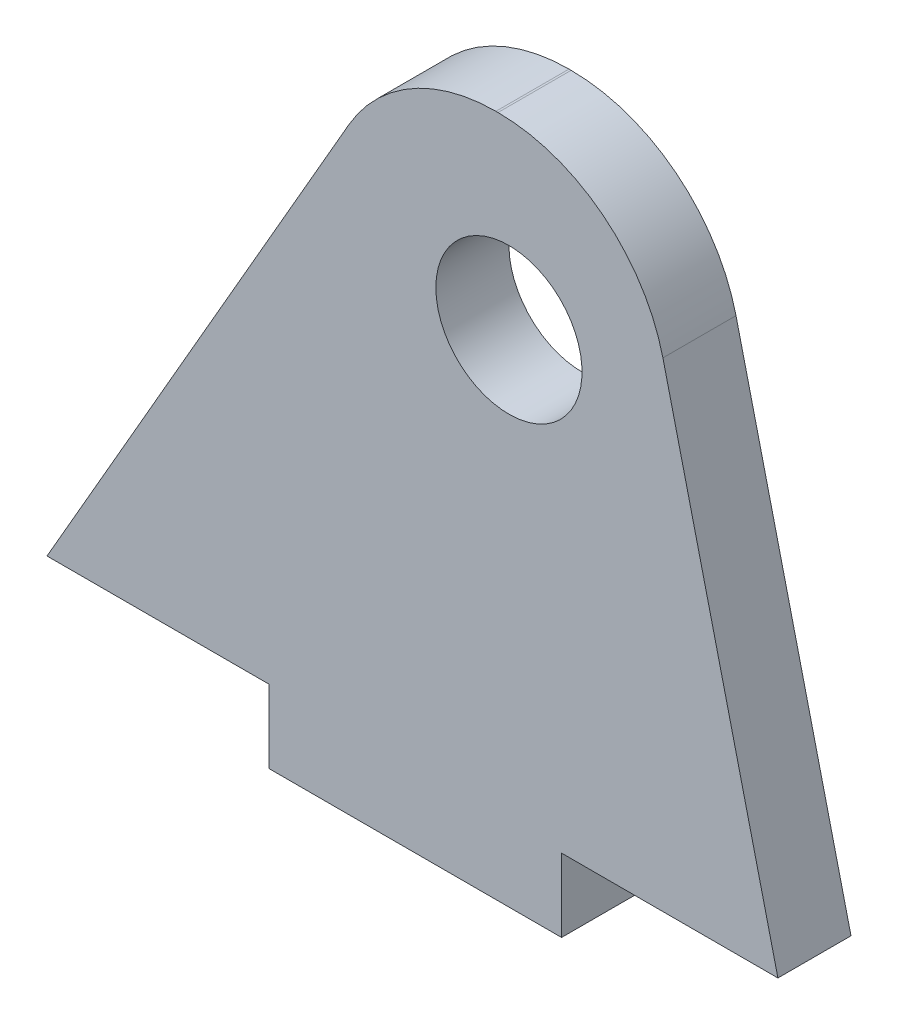
ISO-10303-21;
HEADER;
FILE_DESCRIPTION(('STEP AP214'),'2;1');
FILE_NAME('part.step','',(''),(''),'','','');
FILE_SCHEMA(('AUTOMOTIVE_DESIGN { 1 0 10303 214 1 1 1 1 }'));
ENDSEC;
DATA;
#1=APPLICATION_CONTEXT('core data for automotive mechanical design processes');
#2=APPLICATION_PROTOCOL_DEFINITION('international standard','automotive_design',2000,#1);
#3=PRODUCT_CONTEXT('',#1,'mechanical');
#4=PRODUCT('Part','Part','',(#3));
#5=PRODUCT_RELATED_PRODUCT_CATEGORY('part','',(#4));
#6=PRODUCT_DEFINITION_FORMATION('','',#4);
#7=PRODUCT_DEFINITION_CONTEXT('part definition',#1,'design');
#8=PRODUCT_DEFINITION('design','',#6,#7);
#9=PRODUCT_DEFINITION_SHAPE('','',#8);
#10=(LENGTH_UNIT() NAMED_UNIT(*) SI_UNIT(.MILLI.,.METRE.));
#11=(NAMED_UNIT(*) PLANE_ANGLE_UNIT() SI_UNIT($,.RADIAN.));
#12=(NAMED_UNIT(*) SI_UNIT($,.STERADIAN.) SOLID_ANGLE_UNIT());
#13=UNCERTAINTY_MEASURE_WITH_UNIT(LENGTH_MEASURE(1.E-05),#10,'distance_accuracy_value','');
#14=(GEOMETRIC_REPRESENTATION_CONTEXT(3) GLOBAL_UNCERTAINTY_ASSIGNED_CONTEXT((#13)) GLOBAL_UNIT_ASSIGNED_CONTEXT((#10,
#11,#12)) REPRESENTATION_CONTEXT('',''));
#15=CARTESIAN_POINT('',(0.,0.,0.));
#16=DIRECTION('',(0.,0.,1.));
#17=DIRECTION('',(1.,0.,0.));
#18=AXIS2_PLACEMENT_3D('',#15,#16,#17);
#19=CARTESIAN_POINT('',(-62.178178995026,0.,3.175));
#20=DIRECTION('',(0.,1.,0.));
#21=DIRECTION('',(0.,0.,1.));
#22=AXIS2_PLACEMENT_3D('',#19,#20,#21);
#23=PLANE('',#22);
#24=DIRECTION('',(0.,0.,-1.));
#25=VECTOR('',#24,1.);
#26=CARTESIAN_POINT('',(-52.526178995026,0.,3.175));
#27=LINE('',#26,#25);
#28=CARTESIAN_POINT('',(-52.526178995026,0.,3.175));
#29=VERTEX_POINT('',#28);
#30=CARTESIAN_POINT('',(-52.526178995026,0.,0.));
#31=VERTEX_POINT('',#30);
#32=EDGE_CURVE('E213',#29,#31,#27,.T.);
#33=ORIENTED_EDGE('',*,*,#32,.F.);
#34=DIRECTION('',(1.,0.,0.));
#35=VECTOR('',#34,1.);
#36=CARTESIAN_POINT('',(-62.178178995026,0.,3.175));
#37=LINE('',#36,#35);
#38=CARTESIAN_POINT('',(-62.178178995026,0.,3.175));
#39=VERTEX_POINT('',#38);
#40=EDGE_CURVE('E142',#39,#29,#37,.T.);
#41=ORIENTED_EDGE('',*,*,#40,.F.);
#42=DIRECTION('',(0.,0.,-1.));
#43=VECTOR('',#42,1.);
#44=CARTESIAN_POINT('',(-62.178178995026,0.,3.175));
#45=LINE('',#44,#43);
#46=CARTESIAN_POINT('',(-62.178178995026,0.,0.));
#47=VERTEX_POINT('',#46);
#48=EDGE_CURVE('E148',#39,#47,#45,.T.);
#49=ORIENTED_EDGE('',*,*,#48,.T.);
#50=DIRECTION('',(1.,0.,0.));
#51=VECTOR('',#50,1.);
#52=CARTESIAN_POINT('',(-62.178178995026,0.,0.));
#53=LINE('',#52,#51);
#54=EDGE_CURVE('E143',#47,#31,#53,.T.);
#55=ORIENTED_EDGE('',*,*,#54,.T.);
#56=EDGE_LOOP('',(#33,#41,#49,#55));
#57=FACE_BOUND('',#56,.T.);
#58=ADVANCED_FACE('F39',(#57),#23,.F.);
#59=CARTESIAN_POINT('',(-39.826178995026,0.,3.175));
#60=VERTEX_POINT('',#59);
#61=CARTESIAN_POINT('',(-30.428178995026,0.,3.175));
#62=VERTEX_POINT('',#61);
#63=EDGE_CURVE('E130',#60,#62,#37,.T.);
#64=ORIENTED_EDGE('',*,*,#63,.F.);
#65=DIRECTION('',(0.,0.,-1.));
#66=VECTOR('',#65,1.);
#67=CARTESIAN_POINT('',(-39.826178995026,0.,3.175));
#68=LINE('',#67,#66);
#69=CARTESIAN_POINT('',(-39.826178995026,0.,0.));
#70=VERTEX_POINT('',#69);
#71=EDGE_CURVE('E115',#60,#70,#68,.T.);
#72=ORIENTED_EDGE('',*,*,#71,.T.);
#73=CARTESIAN_POINT('',(-30.428178995026,0.,0.));
#74=VERTEX_POINT('',#73);
#75=EDGE_CURVE('E150',#70,#74,#53,.T.);
#76=ORIENTED_EDGE('',*,*,#75,.T.);
#77=DIRECTION('',(0.,0.,-1.));
#78=VECTOR('',#77,1.);
#79=CARTESIAN_POINT('',(-30.428178995026,0.,3.175));
#80=LINE('',#79,#78);
#81=EDGE_CURVE('E140',#62,#74,#80,.T.);
#82=ORIENTED_EDGE('',*,*,#81,.F.);
#83=EDGE_LOOP('',(#64,#72,#76,#82));
#84=FACE_BOUND('',#83,.T.);
#85=ADVANCED_FACE('F138',(#84),#23,.F.);
#86=CARTESIAN_POINT('',(0.,0.,3.175));
#87=DIRECTION('',(0.,0.,1.));
#88=DIRECTION('',(1.,0.,0.));
#89=AXIS2_PLACEMENT_3D('',#86,#87,#88);
#90=PLANE('',#89);
#91=CARTESIAN_POINT('',(-42.1121789950262,18.542,3.175));
#92=DIRECTION('',(0.,0.,-1.));
#93=DIRECTION('',(-1.,0.,0.));
#94=AXIS2_PLACEMENT_3D('',#91,#92,#93);
#95=CIRCLE('',#94,3.175);
#96=CARTESIAN_POINT('',(-45.2871789950262,18.542,3.175));
#97=VERTEX_POINT('',#96);
#98=EDGE_CURVE('E153',#97,#97,#95,.T.);
#99=ORIENTED_EDGE('',*,*,#98,.T.);
#100=EDGE_LOOP('',(#99));
#101=FACE_BOUND('',#100,.T.);
#102=DIRECTION('',(1.,0.,0.));
#103=VECTOR('',#102,1.);
#104=CARTESIAN_POINT('',(0.,26.4795,3.175));
#105=LINE('',#104,#103);
#106=CARTESIAN_POINT('',(-42.6787402517282,26.4795,3.175));
#107=VERTEX_POINT('',#106);
#108=CARTESIAN_POINT('',(-42.586593378841,26.4795,3.175));
#109=VERTEX_POINT('',#108);
#110=EDGE_CURVE('E185',#107,#109,#105,.T.);
#111=ORIENTED_EDGE('',*,*,#110,.F.);
#112=CARTESIAN_POINT('',(-42.6787402517282,19.1135,3.175));
#113=DIRECTION('',(0.,0.,1.));
#114=DIRECTION('',(1.,0.,0.));
#115=AXIS2_PLACEMENT_3D('',#112,#113,#114);
#116=CIRCLE('',#115,7.366);
#117=CARTESIAN_POINT('',(-49.0628830128672,22.7878267690009,3.175));
#118=VERTEX_POINT('',#117);
#119=EDGE_CURVE('E48',#107,#118,#116,.T.);
#120=ORIENTED_EDGE('',*,*,#119,.T.);
#121=DIRECTION('',(0.498822531767699,0.866704148946377,0.));
#122=VECTOR('',#121,1.);
#123=CARTESIAN_POINT('',(-46.7067608709964,26.8815889905015,3.175));
#124=LINE('',#123,#122);
#125=EDGE_CURVE('E182',#39,#118,#124,.T.);
#126=ORIENTED_EDGE('',*,*,#125,.F.);
#127=ORIENTED_EDGE('',*,*,#40,.T.);
#128=DIRECTION('',(0.,1.,0.));
#129=VECTOR('',#128,1.);
#130=CARTESIAN_POINT('',(-52.526178995026,-3.175,3.175));
#131=LINE('',#130,#129);
#132=CARTESIAN_POINT('',(-52.526178995026,-3.175,3.175));
#133=VERTEX_POINT('',#132);
#134=EDGE_CURVE('E124',#133,#29,#131,.T.);
#135=ORIENTED_EDGE('',*,*,#134,.F.);
#136=DIRECTION('',(-1.,0.,0.));
#137=VECTOR('',#136,1.);
#138=CARTESIAN_POINT('',(-39.826178995026,-3.175,3.175));
#139=LINE('',#138,#137);
#140=CARTESIAN_POINT('',(-39.826178995026,-3.175,3.175));
#141=VERTEX_POINT('',#140);
#142=EDGE_CURVE('E133',#141,#133,#139,.T.);
#143=ORIENTED_EDGE('',*,*,#142,.F.);
#144=DIRECTION('',(0.,-1.,0.));
#145=VECTOR('',#144,1.);
#146=CARTESIAN_POINT('',(-39.826178995026,0.,3.175));
#147=LINE('',#146,#145);
#148=EDGE_CURVE('E118',#60,#141,#147,.T.);
#149=ORIENTED_EDGE('',*,*,#148,.F.);
#150=ORIENTED_EDGE('',*,*,#63,.T.);
#151=DIRECTION('',(0.233196551848822,-0.972429621209587,0.));
#152=VECTOR('',#151,1.);
#153=CARTESIAN_POINT('',(-28.7734753969301,-6.90011400405997,3.175));
#154=LINE('',#153,#152);
#155=CARTESIAN_POINT('',(-35.4236767890112,20.8312258009184,3.175));
#156=VERTEX_POINT('',#155);
#157=EDGE_CURVE('E210',#156,#62,#154,.T.);
#158=ORIENTED_EDGE('',*,*,#157,.F.);
#159=CARTESIAN_POINT('',(-42.586593378841,19.1135,3.175));
#160=DIRECTION('',(0.,0.,1.));
#161=DIRECTION('',(1.,0.,0.));
#162=AXIS2_PLACEMENT_3D('',#159,#160,#161);
#163=CIRCLE('',#162,7.366);
#164=EDGE_CURVE('E176',#156,#109,#163,.T.);
#165=ORIENTED_EDGE('',*,*,#164,.T.);
#166=EDGE_LOOP('',(#111,#120,#126,#127,#135,#143,#149,#150,#158,#165));
#167=FACE_BOUND('',#166,.T.);
#168=ADVANCED_FACE('F129',(#101,#167),#90,.T.);
#169=CARTESIAN_POINT('',(0.,0.,0.));
#170=DIRECTION('',(0.,0.,1.));
#171=DIRECTION('',(1.,0.,0.));
#172=AXIS2_PLACEMENT_3D('',#169,#170,#171);
#173=PLANE('',#172);
#174=CARTESIAN_POINT('',(-42.1121789950262,18.542,0.));
#175=DIRECTION('',(0.,0.,-1.));
#176=DIRECTION('',(-1.,0.,0.));
#177=AXIS2_PLACEMENT_3D('',#174,#175,#176);
#178=CIRCLE('',#177,3.17499999999999);
#179=CARTESIAN_POINT('',(-45.2871789950262,18.542,0.));
#180=VERTEX_POINT('',#179);
#181=EDGE_CURVE('E217',#180,#180,#178,.T.);
#182=ORIENTED_EDGE('',*,*,#181,.F.);
#183=EDGE_LOOP('',(#182));
#184=FACE_BOUND('',#183,.T.);
#185=DIRECTION('',(0.498822531767699,0.866704148946377,0.));
#186=VECTOR('',#185,1.);
#187=CARTESIAN_POINT('',(-46.7067608709964,26.8815889905015,0.));
#188=LINE('',#187,#186);
#189=CARTESIAN_POINT('',(-49.0628830128672,22.7878267690009,0.));
#190=VERTEX_POINT('',#189);
#191=EDGE_CURVE('E201',#47,#190,#188,.T.);
#192=ORIENTED_EDGE('',*,*,#191,.T.);
#193=CARTESIAN_POINT('',(-42.6787402517282,19.1135,0.));
#194=DIRECTION('',(0.,0.,1.));
#195=DIRECTION('',(1.,0.,0.));
#196=AXIS2_PLACEMENT_3D('',#193,#194,#195);
#197=CIRCLE('',#196,7.366);
#198=CARTESIAN_POINT('',(-42.6787402517282,26.4795,0.));
#199=VERTEX_POINT('',#198);
#200=EDGE_CURVE('E166',#190,#199,#197,.F.);
#201=ORIENTED_EDGE('',*,*,#200,.T.);
#202=DIRECTION('',(1.,0.,0.));
#203=VECTOR('',#202,1.);
#204=CARTESIAN_POINT('',(0.,26.4795,0.));
#205=LINE('',#204,#203);
#206=CARTESIAN_POINT('',(-42.586593378841,26.4795,0.));
#207=VERTEX_POINT('',#206);
#208=EDGE_CURVE('E199',#199,#207,#205,.T.);
#209=ORIENTED_EDGE('',*,*,#208,.T.);
#210=CARTESIAN_POINT('',(-42.586593378841,19.1135,0.));
#211=DIRECTION('',(0.,0.,1.));
#212=DIRECTION('',(1.,0.,0.));
#213=AXIS2_PLACEMENT_3D('',#210,#211,#212);
#214=CIRCLE('',#213,7.366);
#215=CARTESIAN_POINT('',(-35.4236767890112,20.8312258009184,0.));
#216=VERTEX_POINT('',#215);
#217=EDGE_CURVE('E163',#207,#216,#214,.F.);
#218=ORIENTED_EDGE('',*,*,#217,.T.);
#219=DIRECTION('',(0.233196551848822,-0.972429621209587,0.));
#220=VECTOR('',#219,1.);
#221=CARTESIAN_POINT('',(-28.7734753969301,-6.90011400405997,0.));
#222=LINE('',#221,#220);
#223=EDGE_CURVE('E206',#216,#74,#222,.T.);
#224=ORIENTED_EDGE('',*,*,#223,.T.);
#225=ORIENTED_EDGE('',*,*,#75,.F.);
#226=DIRECTION('',(0.,-1.,0.));
#227=VECTOR('',#226,1.);
#228=CARTESIAN_POINT('',(-39.826178995026,0.,0.));
#229=LINE('',#228,#227);
#230=CARTESIAN_POINT('',(-39.826178995026,-3.175,0.));
#231=VERTEX_POINT('',#230);
#232=EDGE_CURVE('E55',#70,#231,#229,.T.);
#233=ORIENTED_EDGE('',*,*,#232,.T.);
#234=DIRECTION('',(-1.,0.,0.));
#235=VECTOR('',#234,1.);
#236=CARTESIAN_POINT('',(-39.826178995026,-3.175,0.));
#237=LINE('',#236,#235);
#238=CARTESIAN_POINT('',(-52.526178995026,-3.175,0.));
#239=VERTEX_POINT('',#238);
#240=EDGE_CURVE('E244',#231,#239,#237,.T.);
#241=ORIENTED_EDGE('',*,*,#240,.T.);
#242=DIRECTION('',(0.,1.,0.));
#243=VECTOR('',#242,1.);
#244=CARTESIAN_POINT('',(-52.526178995026,-3.175,0.));
#245=LINE('',#244,#243);
#246=EDGE_CURVE('E135',#239,#31,#245,.T.);
#247=ORIENTED_EDGE('',*,*,#246,.T.);
#248=ORIENTED_EDGE('',*,*,#54,.F.);
#249=EDGE_LOOP('',(#192,#201,#209,#218,#224,#225,#233,#241,#247,#248));
#250=FACE_BOUND('',#249,.T.);
#251=ADVANCED_FACE('F198',(#184,#250),#173,.F.);
#252=CARTESIAN_POINT('',(-42.1121789950262,18.542,0.));
#253=DIRECTION('',(0.,0.,-1.));
#254=DIRECTION('',(-1.,0.,0.));
#255=AXIS2_PLACEMENT_3D('',#252,#253,#254);
#256=CYLINDRICAL_SURFACE('',#255,3.17499999999999);
#257=ORIENTED_EDGE('',*,*,#98,.F.);
#258=EDGE_LOOP('',(#257));
#259=FACE_BOUND('',#258,.T.);
#260=ORIENTED_EDGE('',*,*,#181,.T.);
#261=EDGE_LOOP('',(#260));
#262=FACE_BOUND('',#261,.T.);
#263=ADVANCED_FACE('F284',(#259,#262),#256,.F.);
#264=CARTESIAN_POINT('',(-28.7734753969301,-6.90011400405997,3.175));
#265=DIRECTION('',(0.972429621209587,0.233196551848822,0.));
#266=DIRECTION('',(-0.233196551848822,0.972429621209587,0.));
#267=AXIS2_PLACEMENT_3D('',#264,#265,#266);
#268=PLANE('',#267);
#269=ORIENTED_EDGE('',*,*,#223,.F.);
#270=DIRECTION('',(0.,0.,-1.));
#271=VECTOR('',#270,1.);
#272=CARTESIAN_POINT('',(-35.4236767890112,20.8312258009184,3.175));
#273=LINE('',#272,#271);
#274=EDGE_CURVE('E11',#216,#156,#273,.F.);
#275=ORIENTED_EDGE('',*,*,#274,.T.);
#276=ORIENTED_EDGE('',*,*,#157,.T.);
#277=ORIENTED_EDGE('',*,*,#81,.T.);
#278=EDGE_LOOP('',(#269,#275,#276,#277));
#279=FACE_BOUND('',#278,.T.);
#280=ADVANCED_FACE('F227',(#279),#268,.T.);
#281=CARTESIAN_POINT('',(-46.7067608709964,26.8815889905015,3.175));
#282=DIRECTION('',(-0.866704148946377,0.498822531767699,0.));
#283=DIRECTION('',(-0.498822531767699,-0.866704148946377,0.));
#284=AXIS2_PLACEMENT_3D('',#281,#282,#283);
#285=PLANE('',#284);
#286=ORIENTED_EDGE('',*,*,#125,.T.);
#287=DIRECTION('',(0.,0.,-1.));
#288=VECTOR('',#287,1.);
#289=CARTESIAN_POINT('',(-49.0628830128672,22.7878267690009,3.175));
#290=LINE('',#289,#288);
#291=EDGE_CURVE('E159',#118,#190,#290,.T.);
#292=ORIENTED_EDGE('',*,*,#291,.T.);
#293=ORIENTED_EDGE('',*,*,#191,.F.);
#294=ORIENTED_EDGE('',*,*,#48,.F.);
#295=EDGE_LOOP('',(#286,#292,#293,#294));
#296=FACE_BOUND('',#295,.T.);
#297=ADVANCED_FACE('F190',(#296),#285,.T.);
#298=CARTESIAN_POINT('',(0.,26.4795,3.175));
#299=DIRECTION('',(0.,1.,0.));
#300=DIRECTION('',(0.,0.,1.));
#301=AXIS2_PLACEMENT_3D('',#298,#299,#300);
#302=PLANE('',#301);
#303=ORIENTED_EDGE('',*,*,#208,.F.);
#304=DIRECTION('',(0.,0.,-1.));
#305=VECTOR('',#304,1.);
#306=CARTESIAN_POINT('',(-42.6787402517282,26.4795,3.175));
#307=LINE('',#306,#305);
#308=EDGE_CURVE('E173',#199,#107,#307,.F.);
#309=ORIENTED_EDGE('',*,*,#308,.T.);
#310=ORIENTED_EDGE('',*,*,#110,.T.);
#311=DIRECTION('',(0.,0.,-1.));
#312=VECTOR('',#311,1.);
#313=CARTESIAN_POINT('',(-42.586593378841,26.4795,3.175));
#314=LINE('',#313,#312);
#315=EDGE_CURVE('E169',#109,#207,#314,.T.);
#316=ORIENTED_EDGE('',*,*,#315,.T.);
#317=EDGE_LOOP('',(#303,#309,#310,#316));
#318=FACE_BOUND('',#317,.T.);
#319=ADVANCED_FACE('F203',(#318),#302,.T.);
#320=CARTESIAN_POINT('',(-42.6787402517282,19.1135,3.175));
#321=DIRECTION('',(0.,0.,-1.));
#322=DIRECTION('',(-1.,0.,0.));
#323=AXIS2_PLACEMENT_3D('',#320,#321,#322);
#324=CYLINDRICAL_SURFACE('',#323,7.366);
#325=ORIENTED_EDGE('',*,*,#119,.F.);
#326=ORIENTED_EDGE('',*,*,#308,.F.);
#327=ORIENTED_EDGE('',*,*,#200,.F.);
#328=ORIENTED_EDGE('',*,*,#291,.F.);
#329=EDGE_LOOP('',(#325,#326,#327,#328));
#330=FACE_BOUND('',#329,.T.);
#331=ADVANCED_FACE('F194',(#330),#324,.T.);
#332=CARTESIAN_POINT('',(-42.586593378841,19.1135,3.175));
#333=DIRECTION('',(0.,0.,-1.));
#334=DIRECTION('',(-1.,0.,0.));
#335=AXIS2_PLACEMENT_3D('',#332,#333,#334);
#336=CYLINDRICAL_SURFACE('',#335,7.366);
#337=ORIENTED_EDGE('',*,*,#164,.F.);
#338=ORIENTED_EDGE('',*,*,#274,.F.);
#339=ORIENTED_EDGE('',*,*,#217,.F.);
#340=ORIENTED_EDGE('',*,*,#315,.F.);
#341=EDGE_LOOP('',(#337,#338,#339,#340));
#342=FACE_BOUND('',#341,.T.);
#343=ADVANCED_FACE('F41',(#342),#336,.T.);
#344=CARTESIAN_POINT('',(-52.526178995026,-3.175,3.175));
#345=DIRECTION('',(-1.,0.,0.));
#346=DIRECTION('',(0.,0.,1.));
#347=AXIS2_PLACEMENT_3D('',#344,#345,#346);
#348=PLANE('',#347);
#349=ORIENTED_EDGE('',*,*,#246,.F.);
#350=DIRECTION('',(0.,0.,-1.));
#351=VECTOR('',#350,1.);
#352=CARTESIAN_POINT('',(-52.526178995026,-3.175,3.175));
#353=LINE('',#352,#351);
#354=EDGE_CURVE('E236',#133,#239,#353,.T.);
#355=ORIENTED_EDGE('',*,*,#354,.F.);
#356=ORIENTED_EDGE('',*,*,#134,.T.);
#357=ORIENTED_EDGE('',*,*,#32,.T.);
#358=EDGE_LOOP('',(#349,#355,#356,#357));
#359=FACE_BOUND('',#358,.T.);
#360=ADVANCED_FACE('F259',(#359),#348,.T.);
#361=CARTESIAN_POINT('',(-39.826178995026,-3.175,3.175));
#362=DIRECTION('',(0.,-1.,0.));
#363=DIRECTION('',(0.,0.,-1.));
#364=AXIS2_PLACEMENT_3D('',#361,#362,#363);
#365=PLANE('',#364);
#366=ORIENTED_EDGE('',*,*,#240,.F.);
#367=DIRECTION('',(0.,0.,-1.));
#368=VECTOR('',#367,1.);
#369=CARTESIAN_POINT('',(-39.826178995026,-3.175,3.175));
#370=LINE('',#369,#368);
#371=EDGE_CURVE('E123',#141,#231,#370,.T.);
#372=ORIENTED_EDGE('',*,*,#371,.F.);
#373=ORIENTED_EDGE('',*,*,#142,.T.);
#374=ORIENTED_EDGE('',*,*,#354,.T.);
#375=EDGE_LOOP('',(#366,#372,#373,#374));
#376=FACE_BOUND('',#375,.T.);
#377=ADVANCED_FACE('F255',(#376),#365,.T.);
#378=CARTESIAN_POINT('',(-39.826178995026,0.,3.175));
#379=DIRECTION('',(1.,0.,0.));
#380=DIRECTION('',(0.,0.,-1.));
#381=AXIS2_PLACEMENT_3D('',#378,#379,#380);
#382=PLANE('',#381);
#383=ORIENTED_EDGE('',*,*,#232,.F.);
#384=ORIENTED_EDGE('',*,*,#71,.F.);
#385=ORIENTED_EDGE('',*,*,#148,.T.);
#386=ORIENTED_EDGE('',*,*,#371,.T.);
#387=EDGE_LOOP('',(#383,#384,#385,#386));
#388=FACE_BOUND('',#387,.T.);
#389=ADVANCED_FACE('F117',(#388),#382,.T.);
#390=CLOSED_SHELL('',(#58,#85,#168,#251,#263,#280,#297,#319,#331,#343,#360,#377,#389));
#391=MANIFOLD_SOLID_BREP('B2',#390);
#392=ADVANCED_BREP_SHAPE_REPRESENTATION('',(#18,#391),#14);
#393=SHAPE_DEFINITION_REPRESENTATION(#9,#392);
ENDSEC;
END-ISO-10303-21;
